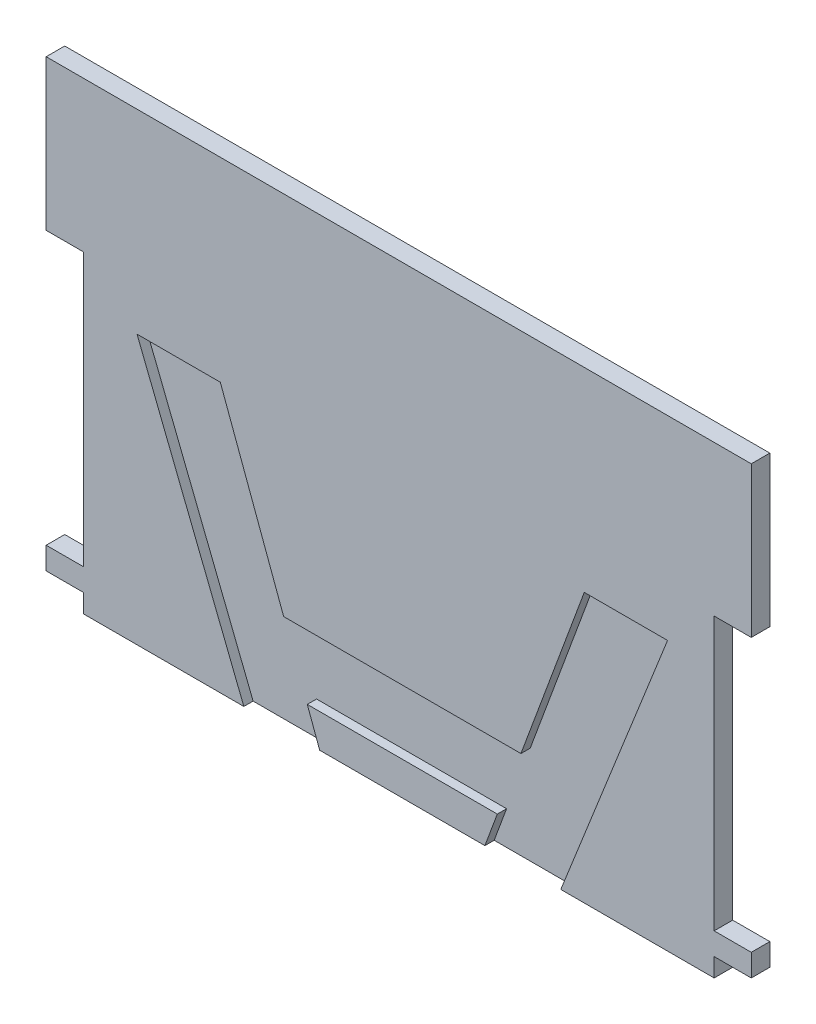
ISO-10303-21;
HEADER;
FILE_DESCRIPTION(('STEP AP214'),'2;1');
FILE_NAME('part.step','',(''),(''),'','','');
FILE_SCHEMA(('AUTOMOTIVE_DESIGN { 1 0 10303 214 1 1 1 1 }'));
ENDSEC;
DATA;
#1=APPLICATION_CONTEXT('core data for automotive mechanical design processes');
#2=APPLICATION_PROTOCOL_DEFINITION('international standard','automotive_design',2000,#1);
#3=PRODUCT_CONTEXT('',#1,'mechanical');
#4=PRODUCT('Part','Part','',(#3));
#5=PRODUCT_RELATED_PRODUCT_CATEGORY('part','',(#4));
#6=PRODUCT_DEFINITION_FORMATION('','',#4);
#7=PRODUCT_DEFINITION_CONTEXT('part definition',#1,'design');
#8=PRODUCT_DEFINITION('design','',#6,#7);
#9=PRODUCT_DEFINITION_SHAPE('','',#8);
#10=(LENGTH_UNIT() NAMED_UNIT(*) SI_UNIT(.MILLI.,.METRE.));
#11=(NAMED_UNIT(*) PLANE_ANGLE_UNIT() SI_UNIT($,.RADIAN.));
#12=(NAMED_UNIT(*) SI_UNIT($,.STERADIAN.) SOLID_ANGLE_UNIT());
#13=UNCERTAINTY_MEASURE_WITH_UNIT(LENGTH_MEASURE(1.E-05),#10,'distance_accuracy_value','');
#14=(GEOMETRIC_REPRESENTATION_CONTEXT(3) GLOBAL_UNCERTAINTY_ASSIGNED_CONTEXT((#13)) GLOBAL_UNIT_ASSIGNED_CONTEXT((#10,
#11,#12)) REPRESENTATION_CONTEXT('',''));
#15=CARTESIAN_POINT('',(0.,0.,0.));
#16=DIRECTION('',(0.,0.,1.));
#17=DIRECTION('',(1.,0.,0.));
#18=AXIS2_PLACEMENT_3D('',#15,#16,#17);
#19=CARTESIAN_POINT('',(-17.,0.5,1.));
#20=DIRECTION('',(0.,1.,0.));
#21=DIRECTION('',(0.,0.,1.));
#22=AXIS2_PLACEMENT_3D('',#19,#20,#21);
#23=PLANE('',#22);
#24=DIRECTION('',(0.,0.,1.));
#25=VECTOR('',#24,1.);
#26=CARTESIAN_POINT('',(8.73217147435897,0.5,1.));
#27=LINE('',#26,#25);
#28=CARTESIAN_POINT('',(8.73217147435897,0.5,0.5));
#29=VERTEX_POINT('',#28);
#30=CARTESIAN_POINT('',(8.73217147435897,0.5,1.));
#31=VERTEX_POINT('',#30);
#32=EDGE_CURVE('E11',#29,#31,#27,.T.);
#33=ORIENTED_EDGE('',*,*,#32,.F.);
#34=DIRECTION('',(-1.,0.,0.));
#35=VECTOR('',#34,1.);
#36=CARTESIAN_POINT('',(-17.,0.5,0.5));
#37=LINE('',#36,#35);
#38=CARTESIAN_POINT('',(4.64409857508627,0.5,0.5));
#39=VERTEX_POINT('',#38);
#40=EDGE_CURVE('E47',#29,#39,#37,.T.);
#41=ORIENTED_EDGE('',*,*,#40,.T.);
#42=DIRECTION('',(0.,0.,-1.));
#43=VECTOR('',#42,1.);
#44=CARTESIAN_POINT('',(4.64409857508627,0.5,1.));
#45=LINE('',#44,#43);
#46=CARTESIAN_POINT('',(4.64409857508627,0.5,1.));
#47=VERTEX_POINT('',#46);
#48=EDGE_CURVE('E202',#47,#39,#45,.T.);
#49=ORIENTED_EDGE('',*,*,#48,.F.);
#50=DIRECTION('',(1.,0.,0.));
#51=VECTOR('',#50,1.);
#52=CARTESIAN_POINT('',(-17.,0.5,1.));
#53=LINE('',#52,#51);
#54=CARTESIAN_POINT('',(-4.25964469981238,0.5,1.));
#55=VERTEX_POINT('',#54);
#56=EDGE_CURVE('E299',#55,#47,#53,.T.);
#57=ORIENTED_EDGE('',*,*,#56,.F.);
#58=DIRECTION('',(0.,0.,1.));
#59=VECTOR('',#58,1.);
#60=CARTESIAN_POINT('',(-4.25964469981238,0.5,1.));
#61=LINE('',#60,#59);
#62=CARTESIAN_POINT('',(-4.25964469981238,0.5,0.5));
#63=VERTEX_POINT('',#62);
#64=EDGE_CURVE('E195',#63,#55,#61,.T.);
#65=ORIENTED_EDGE('',*,*,#64,.F.);
#66=CARTESIAN_POINT('',(-8.34755608974359,0.5,0.5));
#67=VERTEX_POINT('',#66);
#68=EDGE_CURVE('E191',#63,#67,#37,.T.);
#69=ORIENTED_EDGE('',*,*,#68,.T.);
#70=DIRECTION('',(0.,0.,-1.));
#71=VECTOR('',#70,1.);
#72=CARTESIAN_POINT('',(-8.34755608974359,0.5,1.));
#73=LINE('',#72,#71);
#74=CARTESIAN_POINT('',(-8.34755608974359,0.5,1.));
#75=VERTEX_POINT('',#74);
#76=EDGE_CURVE('E200',#75,#67,#73,.T.);
#77=ORIENTED_EDGE('',*,*,#76,.F.);
#78=CARTESIAN_POINT('',(-17.,0.5,1.));
#79=VERTEX_POINT('',#78);
#80=EDGE_CURVE('E294',#79,#75,#53,.T.);
#81=ORIENTED_EDGE('',*,*,#80,.F.);
#82=DIRECTION('',(0.,0.,-1.));
#83=VECTOR('',#82,1.);
#84=CARTESIAN_POINT('',(-17.,0.5,1.));
#85=LINE('',#84,#83);
#86=CARTESIAN_POINT('',(-17.,0.5,0.));
#87=VERTEX_POINT('',#86);
#88=EDGE_CURVE('E209',#79,#87,#85,.T.);
#89=ORIENTED_EDGE('',*,*,#88,.T.);
#90=DIRECTION('',(1.,0.,0.));
#91=VECTOR('',#90,1.);
#92=CARTESIAN_POINT('',(-17.,0.5,0.));
#93=LINE('',#92,#91);
#94=CARTESIAN_POINT('',(17.,0.5,0.));
#95=VERTEX_POINT('',#94);
#96=EDGE_CURVE('E241',#87,#95,#93,.T.);
#97=ORIENTED_EDGE('',*,*,#96,.T.);
#98=DIRECTION('',(0.,0.,-1.));
#99=VECTOR('',#98,1.);
#100=CARTESIAN_POINT('',(17.,0.5,1.));
#101=LINE('',#100,#99);
#102=CARTESIAN_POINT('',(17.,0.5,1.));
#103=VERTEX_POINT('',#102);
#104=EDGE_CURVE('E208',#103,#95,#101,.T.);
#105=ORIENTED_EDGE('',*,*,#104,.F.);
#106=EDGE_CURVE('E291',#31,#103,#53,.T.);
#107=ORIENTED_EDGE('',*,*,#106,.F.);
#108=EDGE_LOOP('',(#33,#41,#49,#57,#65,#69,#77,#81,#89,#97,#105,#107));
#109=FACE_BOUND('',#108,.T.);
#110=ADVANCED_FACE('F39',(#109),#23,.F.);
#111=CARTESIAN_POINT('',(0.,0.,1.));
#112=DIRECTION('',(0.,0.,-1.));
#113=DIRECTION('',(-1.,0.,0.));
#114=AXIS2_PLACEMENT_3D('',#111,#112,#113);
#115=PLANE('',#114);
#116=ORIENTED_EDGE('',*,*,#80,.T.);
#117=DIRECTION('',(-0.369014026975487,0.929423825762679,0.));
#118=VECTOR('',#117,1.);
#119=CARTESIAN_POINT('',(-2.19350961538462,-15.,1.));
#120=LINE('',#119,#118);
#121=CARTESIAN_POINT('',(-14.1045673076923,15.,1.));
#122=VERTEX_POINT('',#121);
#123=EDGE_CURVE('E193',#75,#122,#120,.T.);
#124=ORIENTED_EDGE('',*,*,#123,.T.);
#125=DIRECTION('',(1.,0.,0.));
#126=VECTOR('',#125,1.);
#127=CARTESIAN_POINT('',(-14.1045673076923,15.,1.));
#128=LINE('',#127,#126);
#129=CARTESIAN_POINT('',(-9.61538461538462,15.,1.));
#130=VERTEX_POINT('',#129);
#131=EDGE_CURVE('E383',#122,#130,#128,.T.);
#132=ORIENTED_EDGE('',*,*,#131,.T.);
#133=DIRECTION('',(0.346837004095032,-0.937925419524593,0.));
#134=VECTOR('',#133,1.);
#135=CARTESIAN_POINT('',(-9.61538461538462,15.,1.));
#136=LINE('',#135,#134);
#137=CARTESIAN_POINT('',(-6.20192307692308,5.76923076923077,1.));
#138=VERTEX_POINT('',#137);
#139=EDGE_CURVE('E386',#130,#138,#136,.T.);
#140=ORIENTED_EDGE('',*,*,#139,.T.);
#141=DIRECTION('',(1.,0.,0.));
#142=VECTOR('',#141,1.);
#143=CARTESIAN_POINT('',(-6.20192307692308,5.76923076923077,1.));
#144=LINE('',#143,#142);
#145=CARTESIAN_POINT('',(6.58653846153846,5.76923076923077,1.));
#146=VERTEX_POINT('',#145);
#147=EDGE_CURVE('E392',#138,#146,#144,.T.);
#148=ORIENTED_EDGE('',*,*,#147,.T.);
#149=DIRECTION('',(0.346837004095032,0.937925419524593,0.));
#150=VECTOR('',#149,1.);
#151=CARTESIAN_POINT('',(6.58653846153846,5.76923076923077,1.));
#152=LINE('',#151,#150);
#153=CARTESIAN_POINT('',(10.,15.,1.));
#154=VERTEX_POINT('',#153);
#155=EDGE_CURVE('E394',#146,#154,#152,.T.);
#156=ORIENTED_EDGE('',*,*,#155,.T.);
#157=DIRECTION('',(1.,0.,0.));
#158=VECTOR('',#157,1.);
#159=CARTESIAN_POINT('',(10.,15.,1.));
#160=LINE('',#159,#158);
#161=CARTESIAN_POINT('',(14.4891826923077,15.,1.));
#162=VERTEX_POINT('',#161);
#163=EDGE_CURVE('E376',#154,#162,#160,.T.);
#164=ORIENTED_EDGE('',*,*,#163,.T.);
#165=DIRECTION('',(-0.369014026975487,-0.929423825762679,0.));
#166=VECTOR('',#165,1.);
#167=CARTESIAN_POINT('',(14.4891826923077,15.,1.));
#168=LINE('',#167,#166);
#169=EDGE_CURVE('E382',#162,#31,#168,.T.);
#170=ORIENTED_EDGE('',*,*,#169,.T.);
#171=ORIENTED_EDGE('',*,*,#106,.T.);
#172=DIRECTION('',(0.,1.,0.));
#173=VECTOR('',#172,1.);
#174=CARTESIAN_POINT('',(17.,0.5,1.));
#175=LINE('',#174,#173);
#176=CARTESIAN_POINT('',(17.,1.5,1.));
#177=VERTEX_POINT('',#176);
#178=EDGE_CURVE('E297',#103,#177,#175,.T.);
#179=ORIENTED_EDGE('',*,*,#178,.T.);
#180=DIRECTION('',(1.,0.,0.));
#181=VECTOR('',#180,1.);
#182=CARTESIAN_POINT('',(17.,1.5,1.));
#183=LINE('',#182,#181);
#184=CARTESIAN_POINT('',(19.,1.5,1.));
#185=VERTEX_POINT('',#184);
#186=EDGE_CURVE('E296',#177,#185,#183,.T.);
#187=ORIENTED_EDGE('',*,*,#186,.T.);
#188=DIRECTION('',(0.,1.,0.));
#189=VECTOR('',#188,1.);
#190=CARTESIAN_POINT('',(19.,1.5,1.));
#191=LINE('',#190,#189);
#192=CARTESIAN_POINT('',(19.,2.7,1.));
#193=VERTEX_POINT('',#192);
#194=EDGE_CURVE('E303',#185,#193,#191,.T.);
#195=ORIENTED_EDGE('',*,*,#194,.T.);
#196=DIRECTION('',(-1.,0.,0.));
#197=VECTOR('',#196,1.);
#198=CARTESIAN_POINT('',(19.,2.7,1.));
#199=LINE('',#198,#197);
#200=CARTESIAN_POINT('',(17.,2.7,1.));
#201=VERTEX_POINT('',#200);
#202=EDGE_CURVE('E301',#193,#201,#199,.T.);
#203=ORIENTED_EDGE('',*,*,#202,.T.);
#204=DIRECTION('',(0.,1.,0.));
#205=VECTOR('',#204,1.);
#206=CARTESIAN_POINT('',(17.,2.7,1.));
#207=LINE('',#206,#205);
#208=CARTESIAN_POINT('',(17.,17.3947217067352,1.));
#209=VERTEX_POINT('',#208);
#210=EDGE_CURVE('E304',#201,#209,#207,.T.);
#211=ORIENTED_EDGE('',*,*,#210,.T.);
#212=DIRECTION('',(1.,0.,0.));
#213=VECTOR('',#212,1.);
#214=CARTESIAN_POINT('',(17.,17.3947217067352,1.));
#215=LINE('',#214,#213);
#216=CARTESIAN_POINT('',(19.,17.3947217067352,1.));
#217=VERTEX_POINT('',#216);
#218=EDGE_CURVE('E310',#209,#217,#215,.T.);
#219=ORIENTED_EDGE('',*,*,#218,.T.);
#220=DIRECTION('',(0.,1.,0.));
#221=VECTOR('',#220,1.);
#222=CARTESIAN_POINT('',(19.,17.3947217067352,1.));
#223=LINE('',#222,#221);
#224=CARTESIAN_POINT('',(19.,25.5,1.));
#225=VERTEX_POINT('',#224);
#226=EDGE_CURVE('E309',#217,#225,#223,.T.);
#227=ORIENTED_EDGE('',*,*,#226,.T.);
#228=DIRECTION('',(-1.,0.,0.));
#229=VECTOR('',#228,1.);
#230=CARTESIAN_POINT('',(19.,25.5,1.));
#231=LINE('',#230,#229);
#232=CARTESIAN_POINT('',(-19.,25.5,1.));
#233=VERTEX_POINT('',#232);
#234=EDGE_CURVE('E311',#225,#233,#231,.T.);
#235=ORIENTED_EDGE('',*,*,#234,.T.);
#236=DIRECTION('',(0.,-1.,0.));
#237=VECTOR('',#236,1.);
#238=CARTESIAN_POINT('',(-19.,25.5,1.));
#239=LINE('',#238,#237);
#240=CARTESIAN_POINT('',(-19.,17.3947217067352,1.));
#241=VERTEX_POINT('',#240);
#242=EDGE_CURVE('E313',#233,#241,#239,.T.);
#243=ORIENTED_EDGE('',*,*,#242,.T.);
#244=DIRECTION('',(1.,0.,0.));
#245=VECTOR('',#244,1.);
#246=CARTESIAN_POINT('',(-19.,17.3947217067352,1.));
#247=LINE('',#246,#245);
#248=CARTESIAN_POINT('',(-17.,17.3947217067352,1.));
#249=VERTEX_POINT('',#248);
#250=EDGE_CURVE('E314',#241,#249,#247,.T.);
#251=ORIENTED_EDGE('',*,*,#250,.T.);
#252=DIRECTION('',(0.,-1.,0.));
#253=VECTOR('',#252,1.);
#254=CARTESIAN_POINT('',(-17.,17.3947217067352,1.));
#255=LINE('',#254,#253);
#256=CARTESIAN_POINT('',(-17.,2.7,1.));
#257=VERTEX_POINT('',#256);
#258=EDGE_CURVE('E174',#249,#257,#255,.T.);
#259=ORIENTED_EDGE('',*,*,#258,.T.);
#260=DIRECTION('',(-1.,0.,0.));
#261=VECTOR('',#260,1.);
#262=CARTESIAN_POINT('',(-17.,2.7,1.));
#263=LINE('',#262,#261);
#264=CARTESIAN_POINT('',(-19.,2.7,1.));
#265=VERTEX_POINT('',#264);
#266=EDGE_CURVE('E167',#257,#265,#263,.T.);
#267=ORIENTED_EDGE('',*,*,#266,.T.);
#268=DIRECTION('',(0.,-1.,0.));
#269=VECTOR('',#268,1.);
#270=CARTESIAN_POINT('',(-19.,2.7,1.));
#271=LINE('',#270,#269);
#272=CARTESIAN_POINT('',(-19.,1.5,1.));
#273=VERTEX_POINT('',#272);
#274=EDGE_CURVE('E175',#265,#273,#271,.T.);
#275=ORIENTED_EDGE('',*,*,#274,.T.);
#276=DIRECTION('',(1.,0.,0.));
#277=VECTOR('',#276,1.);
#278=CARTESIAN_POINT('',(-19.,1.5,1.));
#279=LINE('',#278,#277);
#280=CARTESIAN_POINT('',(-17.,1.5,1.));
#281=VERTEX_POINT('',#280);
#282=EDGE_CURVE('E249',#273,#281,#279,.T.);
#283=ORIENTED_EDGE('',*,*,#282,.T.);
#284=DIRECTION('',(0.,-1.,0.));
#285=VECTOR('',#284,1.);
#286=CARTESIAN_POINT('',(-17.,1.5,1.));
#287=LINE('',#286,#285);
#288=EDGE_CURVE('E122',#281,#79,#287,.T.);
#289=ORIENTED_EDGE('',*,*,#288,.T.);
#290=EDGE_LOOP('',(#116,#124,#132,#140,#148,#156,#164,#170,#171,#179,#187,#195,#203,#211,#219,
#227,#235,#243,#251,#259,#267,#275,#283,#289));
#291=FACE_BOUND('',#290,.T.);
#292=ADVANCED_FACE('F169',(#291),#115,.F.);
#293=CARTESIAN_POINT('',(-19.,1.5,1.));
#294=DIRECTION('',(0.,1.,0.));
#295=DIRECTION('',(-1.,0.,0.));
#296=AXIS2_PLACEMENT_3D('',#293,#294,#295);
#297=PLANE('',#296);
#298=DIRECTION('',(-1.,0.,0.));
#299=VECTOR('',#298,1.);
#300=CARTESIAN_POINT('',(-19.,1.5,0.));
#301=LINE('',#300,#299);
#302=CARTESIAN_POINT('',(-19.,1.5,0.));
#303=VERTEX_POINT('',#302);
#304=CARTESIAN_POINT('',(-17.,1.5,0.));
#305=VERTEX_POINT('',#304);
#306=EDGE_CURVE('E43',#303,#305,#301,.F.);
#307=ORIENTED_EDGE('',*,*,#306,.T.);
#308=DIRECTION('',(0.,0.,-1.));
#309=VECTOR('',#308,1.);
#310=CARTESIAN_POINT('',(-17.,1.5,1.));
#311=LINE('',#310,#309);
#312=EDGE_CURVE('E204',#281,#305,#311,.T.);
#313=ORIENTED_EDGE('',*,*,#312,.F.);
#314=ORIENTED_EDGE('',*,*,#282,.F.);
#315=DIRECTION('',(0.,0.,-1.));
#316=VECTOR('',#315,1.);
#317=CARTESIAN_POINT('',(-19.,1.5,1.));
#318=LINE('',#317,#316);
#319=EDGE_CURVE('E182',#273,#303,#318,.T.);
#320=ORIENTED_EDGE('',*,*,#319,.T.);
#321=EDGE_LOOP('',(#307,#313,#314,#320));
#322=FACE_BOUND('',#321,.T.);
#323=ADVANCED_FACE('F41',(#322),#297,.F.);
#324=CARTESIAN_POINT('',(-17.,1.5,1.));
#325=DIRECTION('',(1.,0.,0.));
#326=DIRECTION('',(0.,0.,-1.));
#327=AXIS2_PLACEMENT_3D('',#324,#325,#326);
#328=PLANE('',#327);
#329=DIRECTION('',(0.,1.,0.));
#330=VECTOR('',#329,1.);
#331=CARTESIAN_POINT('',(-17.,1.5,0.));
#332=LINE('',#331,#330);
#333=EDGE_CURVE('E250',#305,#87,#332,.F.);
#334=ORIENTED_EDGE('',*,*,#333,.T.);
#335=ORIENTED_EDGE('',*,*,#88,.F.);
#336=ORIENTED_EDGE('',*,*,#288,.F.);
#337=ORIENTED_EDGE('',*,*,#312,.T.);
#338=EDGE_LOOP('',(#334,#335,#336,#337));
#339=FACE_BOUND('',#338,.T.);
#340=ADVANCED_FACE('F328',(#339),#328,.F.);
#341=CARTESIAN_POINT('',(17.,0.5,1.));
#342=DIRECTION('',(-1.,0.,0.));
#343=DIRECTION('',(0.,0.,1.));
#344=AXIS2_PLACEMENT_3D('',#341,#342,#343);
#345=PLANE('',#344);
#346=DIRECTION('',(0.,1.,0.));
#347=VECTOR('',#346,1.);
#348=CARTESIAN_POINT('',(17.,0.5,0.));
#349=LINE('',#348,#347);
#350=CARTESIAN_POINT('',(17.,1.5,0.));
#351=VERTEX_POINT('',#350);
#352=EDGE_CURVE('E247',#95,#351,#349,.T.);
#353=ORIENTED_EDGE('',*,*,#352,.T.);
#354=DIRECTION('',(0.,0.,-1.));
#355=VECTOR('',#354,1.);
#356=CARTESIAN_POINT('',(17.,1.5,1.));
#357=LINE('',#356,#355);
#358=EDGE_CURVE('E211',#177,#351,#357,.T.);
#359=ORIENTED_EDGE('',*,*,#358,.F.);
#360=ORIENTED_EDGE('',*,*,#178,.F.);
#361=ORIENTED_EDGE('',*,*,#104,.T.);
#362=EDGE_LOOP('',(#353,#359,#360,#361));
#363=FACE_BOUND('',#362,.T.);
#364=ADVANCED_FACE('F520',(#363),#345,.F.);
#365=CARTESIAN_POINT('',(17.,1.5,1.));
#366=DIRECTION('',(0.,1.,0.));
#367=DIRECTION('',(-1.,0.,0.));
#368=AXIS2_PLACEMENT_3D('',#365,#366,#367);
#369=PLANE('',#368);
#370=DIRECTION('',(-1.,0.,0.));
#371=VECTOR('',#370,1.);
#372=CARTESIAN_POINT('',(17.,1.5,0.));
#373=LINE('',#372,#371);
#374=CARTESIAN_POINT('',(19.,1.5,0.));
#375=VERTEX_POINT('',#374);
#376=EDGE_CURVE('E267',#351,#375,#373,.F.);
#377=ORIENTED_EDGE('',*,*,#376,.T.);
#378=DIRECTION('',(0.,0.,-1.));
#379=VECTOR('',#378,1.);
#380=CARTESIAN_POINT('',(19.,1.5,1.));
#381=LINE('',#380,#379);
#382=EDGE_CURVE('E218',#185,#375,#381,.T.);
#383=ORIENTED_EDGE('',*,*,#382,.F.);
#384=ORIENTED_EDGE('',*,*,#186,.F.);
#385=ORIENTED_EDGE('',*,*,#358,.T.);
#386=EDGE_LOOP('',(#377,#383,#384,#385));
#387=FACE_BOUND('',#386,.T.);
#388=ADVANCED_FACE('F525',(#387),#369,.F.);
#389=CARTESIAN_POINT('',(19.,1.5,1.));
#390=DIRECTION('',(-1.,0.,0.));
#391=DIRECTION('',(0.,0.,1.));
#392=AXIS2_PLACEMENT_3D('',#389,#390,#391);
#393=PLANE('',#392);
#394=DIRECTION('',(0.,1.,0.));
#395=VECTOR('',#394,1.);
#396=CARTESIAN_POINT('',(19.,1.5,0.));
#397=LINE('',#396,#395);
#398=CARTESIAN_POINT('',(19.,2.7,0.));
#399=VERTEX_POINT('',#398);
#400=EDGE_CURVE('E270',#375,#399,#397,.T.);
#401=ORIENTED_EDGE('',*,*,#400,.T.);
#402=DIRECTION('',(0.,0.,-1.));
#403=VECTOR('',#402,1.);
#404=CARTESIAN_POINT('',(19.,2.7,1.));
#405=LINE('',#404,#403);
#406=EDGE_CURVE('E219',#193,#399,#405,.T.);
#407=ORIENTED_EDGE('',*,*,#406,.F.);
#408=ORIENTED_EDGE('',*,*,#194,.F.);
#409=ORIENTED_EDGE('',*,*,#382,.T.);
#410=EDGE_LOOP('',(#401,#407,#408,#409));
#411=FACE_BOUND('',#410,.T.);
#412=ADVANCED_FACE('F552',(#411),#393,.F.);
#413=CARTESIAN_POINT('',(19.,2.7,1.));
#414=DIRECTION('',(0.,-1.,0.));
#415=DIRECTION('',(0.,0.,-1.));
#416=AXIS2_PLACEMENT_3D('',#413,#414,#415);
#417=PLANE('',#416);
#418=DIRECTION('',(1.,0.,0.));
#419=VECTOR('',#418,1.);
#420=CARTESIAN_POINT('',(19.,2.7,0.));
#421=LINE('',#420,#419);
#422=CARTESIAN_POINT('',(17.,2.7,0.));
#423=VERTEX_POINT('',#422);
#424=EDGE_CURVE('E262',#399,#423,#421,.F.);
#425=ORIENTED_EDGE('',*,*,#424,.T.);
#426=DIRECTION('',(0.,0.,-1.));
#427=VECTOR('',#426,1.);
#428=CARTESIAN_POINT('',(17.,2.7,1.));
#429=LINE('',#428,#427);
#430=EDGE_CURVE('E225',#201,#423,#429,.T.);
#431=ORIENTED_EDGE('',*,*,#430,.F.);
#432=ORIENTED_EDGE('',*,*,#202,.F.);
#433=ORIENTED_EDGE('',*,*,#406,.T.);
#434=EDGE_LOOP('',(#425,#431,#432,#433));
#435=FACE_BOUND('',#434,.T.);
#436=ADVANCED_FACE('F562',(#435),#417,.F.);
#437=CARTESIAN_POINT('',(17.,2.7,1.));
#438=DIRECTION('',(-1.,0.,0.));
#439=DIRECTION('',(0.,0.,1.));
#440=AXIS2_PLACEMENT_3D('',#437,#438,#439);
#441=PLANE('',#440);
#442=DIRECTION('',(0.,1.,0.));
#443=VECTOR('',#442,1.);
#444=CARTESIAN_POINT('',(17.,2.7,0.));
#445=LINE('',#444,#443);
#446=CARTESIAN_POINT('',(17.,17.3947217067352,0.));
#447=VERTEX_POINT('',#446);
#448=EDGE_CURVE('E261',#423,#447,#445,.T.);
#449=ORIENTED_EDGE('',*,*,#448,.T.);
#450=DIRECTION('',(0.,0.,-1.));
#451=VECTOR('',#450,1.);
#452=CARTESIAN_POINT('',(17.,17.3947217067352,1.));
#453=LINE('',#452,#451);
#454=EDGE_CURVE('E224',#209,#447,#453,.T.);
#455=ORIENTED_EDGE('',*,*,#454,.F.);
#456=ORIENTED_EDGE('',*,*,#210,.F.);
#457=ORIENTED_EDGE('',*,*,#430,.T.);
#458=EDGE_LOOP('',(#449,#455,#456,#457));
#459=FACE_BOUND('',#458,.T.);
#460=ADVANCED_FACE('F573',(#459),#441,.F.);
#461=CARTESIAN_POINT('',(17.,17.3947217067352,1.));
#462=DIRECTION('',(0.,1.,0.));
#463=DIRECTION('',(0.,0.,1.));
#464=AXIS2_PLACEMENT_3D('',#461,#462,#463);
#465=PLANE('',#464);
#466=DIRECTION('',(1.,0.,0.));
#467=VECTOR('',#466,1.);
#468=CARTESIAN_POINT('',(17.,17.3947217067352,0.));
#469=LINE('',#468,#467);
#470=CARTESIAN_POINT('',(19.,17.3947217067352,0.));
#471=VERTEX_POINT('',#470);
#472=EDGE_CURVE('E263',#447,#471,#469,.T.);
#473=ORIENTED_EDGE('',*,*,#472,.T.);
#474=DIRECTION('',(0.,0.,-1.));
#475=VECTOR('',#474,1.);
#476=CARTESIAN_POINT('',(19.,17.3947217067352,1.));
#477=LINE('',#476,#475);
#478=EDGE_CURVE('E228',#217,#471,#477,.T.);
#479=ORIENTED_EDGE('',*,*,#478,.F.);
#480=ORIENTED_EDGE('',*,*,#218,.F.);
#481=ORIENTED_EDGE('',*,*,#454,.T.);
#482=EDGE_LOOP('',(#473,#479,#480,#481));
#483=FACE_BOUND('',#482,.T.);
#484=ADVANCED_FACE('F581',(#483),#465,.F.);
#485=CARTESIAN_POINT('',(19.,17.3947217067352,1.));
#486=DIRECTION('',(-1.,0.,0.));
#487=DIRECTION('',(0.,0.,1.));
#488=AXIS2_PLACEMENT_3D('',#485,#486,#487);
#489=PLANE('',#488);
#490=DIRECTION('',(0.,1.,0.));
#491=VECTOR('',#490,1.);
#492=CARTESIAN_POINT('',(19.,17.3947217067352,0.));
#493=LINE('',#492,#491);
#494=CARTESIAN_POINT('',(19.,25.5,0.));
#495=VERTEX_POINT('',#494);
#496=EDGE_CURVE('E260',#471,#495,#493,.T.);
#497=ORIENTED_EDGE('',*,*,#496,.T.);
#498=DIRECTION('',(0.,0.,-1.));
#499=VECTOR('',#498,1.);
#500=CARTESIAN_POINT('',(19.,25.5,1.));
#501=LINE('',#500,#499);
#502=EDGE_CURVE('E231',#225,#495,#501,.T.);
#503=ORIENTED_EDGE('',*,*,#502,.F.);
#504=ORIENTED_EDGE('',*,*,#226,.F.);
#505=ORIENTED_EDGE('',*,*,#478,.T.);
#506=EDGE_LOOP('',(#497,#503,#504,#505));
#507=FACE_BOUND('',#506,.T.);
#508=ADVANCED_FACE('F591',(#507),#489,.F.);
#509=CARTESIAN_POINT('',(19.,25.5,1.));
#510=DIRECTION('',(0.,-1.,0.));
#511=DIRECTION('',(0.,0.,-1.));
#512=AXIS2_PLACEMENT_3D('',#509,#510,#511);
#513=PLANE('',#512);
#514=DIRECTION('',(1.,0.,0.));
#515=VECTOR('',#514,1.);
#516=CARTESIAN_POINT('',(19.,25.5,0.));
#517=LINE('',#516,#515);
#518=CARTESIAN_POINT('',(-19.,25.5,0.));
#519=VERTEX_POINT('',#518);
#520=EDGE_CURVE('E257',#495,#519,#517,.F.);
#521=ORIENTED_EDGE('',*,*,#520,.T.);
#522=DIRECTION('',(0.,0.,-1.));
#523=VECTOR('',#522,1.);
#524=CARTESIAN_POINT('',(-19.,25.5,1.));
#525=LINE('',#524,#523);
#526=EDGE_CURVE('E233',#233,#519,#525,.T.);
#527=ORIENTED_EDGE('',*,*,#526,.F.);
#528=ORIENTED_EDGE('',*,*,#234,.F.);
#529=ORIENTED_EDGE('',*,*,#502,.T.);
#530=EDGE_LOOP('',(#521,#527,#528,#529));
#531=FACE_BOUND('',#530,.T.);
#532=ADVANCED_FACE('F602',(#531),#513,.F.);
#533=CARTESIAN_POINT('',(-19.,25.5,1.));
#534=DIRECTION('',(1.,0.,0.));
#535=DIRECTION('',(0.,0.,-1.));
#536=AXIS2_PLACEMENT_3D('',#533,#534,#535);
#537=PLANE('',#536);
#538=DIRECTION('',(0.,1.,0.));
#539=VECTOR('',#538,1.);
#540=CARTESIAN_POINT('',(-19.,25.5,0.));
#541=LINE('',#540,#539);
#542=CARTESIAN_POINT('',(-19.,17.3947217067352,0.));
#543=VERTEX_POINT('',#542);
#544=EDGE_CURVE('E253',#519,#543,#541,.F.);
#545=ORIENTED_EDGE('',*,*,#544,.T.);
#546=DIRECTION('',(0.,0.,-1.));
#547=VECTOR('',#546,1.);
#548=CARTESIAN_POINT('',(-19.,17.3947217067352,1.));
#549=LINE('',#548,#547);
#550=EDGE_CURVE('E240',#241,#543,#549,.T.);
#551=ORIENTED_EDGE('',*,*,#550,.F.);
#552=ORIENTED_EDGE('',*,*,#242,.F.);
#553=ORIENTED_EDGE('',*,*,#526,.T.);
#554=EDGE_LOOP('',(#545,#551,#552,#553));
#555=FACE_BOUND('',#554,.T.);
#556=ADVANCED_FACE('F612',(#555),#537,.F.);
#557=CARTESIAN_POINT('',(-19.,17.3947217067352,1.));
#558=DIRECTION('',(0.,1.,0.));
#559=DIRECTION('',(0.,0.,1.));
#560=AXIS2_PLACEMENT_3D('',#557,#558,#559);
#561=PLANE('',#560);
#562=DIRECTION('',(1.,0.,0.));
#563=VECTOR('',#562,1.);
#564=CARTESIAN_POINT('',(-19.,17.3947217067352,0.));
#565=LINE('',#564,#563);
#566=CARTESIAN_POINT('',(-17.,17.3947217067352,0.));
#567=VERTEX_POINT('',#566);
#568=EDGE_CURVE('E255',#543,#567,#565,.T.);
#569=ORIENTED_EDGE('',*,*,#568,.T.);
#570=DIRECTION('',(0.,0.,-1.));
#571=VECTOR('',#570,1.);
#572=CARTESIAN_POINT('',(-17.,17.3947217067352,1.));
#573=LINE('',#572,#571);
#574=EDGE_CURVE('E238',#249,#567,#573,.T.);
#575=ORIENTED_EDGE('',*,*,#574,.F.);
#576=ORIENTED_EDGE('',*,*,#250,.F.);
#577=ORIENTED_EDGE('',*,*,#550,.T.);
#578=EDGE_LOOP('',(#569,#575,#576,#577));
#579=FACE_BOUND('',#578,.T.);
#580=ADVANCED_FACE('F321',(#579),#561,.F.);
#581=CARTESIAN_POINT('',(-17.,17.3947217067352,1.));
#582=DIRECTION('',(1.,0.,0.));
#583=DIRECTION('',(0.,0.,-1.));
#584=AXIS2_PLACEMENT_3D('',#581,#582,#583);
#585=PLANE('',#584);
#586=DIRECTION('',(0.,1.,0.));
#587=VECTOR('',#586,1.);
#588=CARTESIAN_POINT('',(-17.,17.3947217067352,0.));
#589=LINE('',#588,#587);
#590=CARTESIAN_POINT('',(-17.,2.7,0.));
#591=VERTEX_POINT('',#590);
#592=EDGE_CURVE('E252',#567,#591,#589,.F.);
#593=ORIENTED_EDGE('',*,*,#592,.T.);
#594=DIRECTION('',(0.,0.,-1.));
#595=VECTOR('',#594,1.);
#596=CARTESIAN_POINT('',(-17.,2.7,1.));
#597=LINE('',#596,#595);
#598=EDGE_CURVE('E183',#257,#591,#597,.T.);
#599=ORIENTED_EDGE('',*,*,#598,.F.);
#600=ORIENTED_EDGE('',*,*,#258,.F.);
#601=ORIENTED_EDGE('',*,*,#574,.T.);
#602=EDGE_LOOP('',(#593,#599,#600,#601));
#603=FACE_BOUND('',#602,.T.);
#604=ADVANCED_FACE('F324',(#603),#585,.F.);
#605=CARTESIAN_POINT('',(-17.,2.7,1.));
#606=DIRECTION('',(0.,-1.,0.));
#607=DIRECTION('',(0.,0.,-1.));
#608=AXIS2_PLACEMENT_3D('',#605,#606,#607);
#609=PLANE('',#608);
#610=DIRECTION('',(1.,0.,0.));
#611=VECTOR('',#610,1.);
#612=CARTESIAN_POINT('',(-17.,2.7,0.));
#613=LINE('',#612,#611);
#614=CARTESIAN_POINT('',(-19.,2.7,0.));
#615=VERTEX_POINT('',#614);
#616=EDGE_CURVE('E185',#591,#615,#613,.F.);
#617=ORIENTED_EDGE('',*,*,#616,.T.);
#618=DIRECTION('',(0.,0.,-1.));
#619=VECTOR('',#618,1.);
#620=CARTESIAN_POINT('',(-19.,2.7,1.));
#621=LINE('',#620,#619);
#622=EDGE_CURVE('E177',#265,#615,#621,.T.);
#623=ORIENTED_EDGE('',*,*,#622,.F.);
#624=ORIENTED_EDGE('',*,*,#266,.F.);
#625=ORIENTED_EDGE('',*,*,#598,.T.);
#626=EDGE_LOOP('',(#617,#623,#624,#625));
#627=FACE_BOUND('',#626,.T.);
#628=ADVANCED_FACE('F179',(#627),#609,.F.);
#629=CARTESIAN_POINT('',(-19.,2.7,1.));
#630=DIRECTION('',(1.,0.,0.));
#631=DIRECTION('',(0.,0.,-1.));
#632=AXIS2_PLACEMENT_3D('',#629,#630,#631);
#633=PLANE('',#632);
#634=DIRECTION('',(0.,1.,0.));
#635=VECTOR('',#634,1.);
#636=CARTESIAN_POINT('',(-19.,2.7,0.));
#637=LINE('',#636,#635);
#638=EDGE_CURVE('E111',#615,#303,#637,.F.);
#639=ORIENTED_EDGE('',*,*,#638,.T.);
#640=ORIENTED_EDGE('',*,*,#319,.F.);
#641=ORIENTED_EDGE('',*,*,#274,.F.);
#642=ORIENTED_EDGE('',*,*,#622,.T.);
#643=EDGE_LOOP('',(#639,#640,#641,#642));
#644=FACE_BOUND('',#643,.T.);
#645=ADVANCED_FACE('F186',(#644),#633,.F.);
#646=ORIENTED_EDGE('',*,*,#56,.T.);
#647=DIRECTION('',(0.346805908159069,0.93793691795662,0.));
#648=VECTOR('',#647,1.);
#649=CARTESIAN_POINT('',(2.24158653846154,-5.99759615384616,1.));
#650=LINE('',#649,#648);
#651=CARTESIAN_POINT('',(5.3125,2.30769230769231,1.));
#652=VERTEX_POINT('',#651);
#653=EDGE_CURVE('E207',#47,#652,#650,.T.);
#654=ORIENTED_EDGE('',*,*,#653,.T.);
#655=DIRECTION('',(-1.,0.,0.));
#656=VECTOR('',#655,1.);
#657=CARTESIAN_POINT('',(5.3125,2.30769230769231,1.));
#658=LINE('',#657,#656);
#659=CARTESIAN_POINT('',(-4.92788461538462,2.30769230769231,1.));
#660=VERTEX_POINT('',#659);
#661=EDGE_CURVE('E474',#652,#660,#658,.T.);
#662=ORIENTED_EDGE('',*,*,#661,.T.);
#663=DIRECTION('',(0.346732183468385,-0.937964174660869,0.));
#664=VECTOR('',#663,1.);
#665=CARTESIAN_POINT('',(-4.92788461538462,2.30769230769231,1.));
#666=LINE('',#665,#664);
#667=EDGE_CURVE('E59',#660,#55,#666,.T.);
#668=ORIENTED_EDGE('',*,*,#667,.T.);
#669=EDGE_LOOP('',(#646,#654,#662,#668));
#670=FACE_BOUND('',#669,.T.);
#671=ADVANCED_FACE('F465',(#670),#115,.F.);
#672=CARTESIAN_POINT('',(0.,0.,0.));
#673=DIRECTION('',(0.,0.,-1.));
#674=DIRECTION('',(-1.,0.,0.));
#675=AXIS2_PLACEMENT_3D('',#672,#673,#674);
#676=PLANE('',#675);
#677=ORIENTED_EDGE('',*,*,#306,.F.);
#678=ORIENTED_EDGE('',*,*,#638,.F.);
#679=ORIENTED_EDGE('',*,*,#616,.F.);
#680=ORIENTED_EDGE('',*,*,#592,.F.);
#681=ORIENTED_EDGE('',*,*,#568,.F.);
#682=ORIENTED_EDGE('',*,*,#544,.F.);
#683=ORIENTED_EDGE('',*,*,#520,.F.);
#684=ORIENTED_EDGE('',*,*,#496,.F.);
#685=ORIENTED_EDGE('',*,*,#472,.F.);
#686=ORIENTED_EDGE('',*,*,#448,.F.);
#687=ORIENTED_EDGE('',*,*,#424,.F.);
#688=ORIENTED_EDGE('',*,*,#400,.F.);
#689=ORIENTED_EDGE('',*,*,#376,.F.);
#690=ORIENTED_EDGE('',*,*,#352,.F.);
#691=ORIENTED_EDGE('',*,*,#96,.F.);
#692=ORIENTED_EDGE('',*,*,#333,.F.);
#693=EDGE_LOOP('',(#677,#678,#679,#680,#681,#682,#683,#684,#685,#686,#687,#688,#689,#690,#691,#692));
#694=FACE_BOUND('',#693,.T.);
#695=ADVANCED_FACE('F330',(#694),#676,.T.);
#696=CARTESIAN_POINT('',(14.4891826923077,15.,0.5));
#697=DIRECTION('',(-0.929423825762679,0.369014026975487,0.));
#698=DIRECTION('',(-0.369014026975487,-0.929423825762679,0.));
#699=AXIS2_PLACEMENT_3D('',#696,#697,#698);
#700=PLANE('',#699);
#701=ORIENTED_EDGE('',*,*,#32,.T.);
#702=ORIENTED_EDGE('',*,*,#169,.F.);
#703=DIRECTION('',(0.,0.,1.));
#704=VECTOR('',#703,1.);
#705=CARTESIAN_POINT('',(14.4891826923077,15.,0.5));
#706=LINE('',#705,#704);
#707=CARTESIAN_POINT('',(14.4891826923077,15.,0.5));
#708=VERTEX_POINT('',#707);
#709=EDGE_CURVE('E273',#708,#162,#706,.T.);
#710=ORIENTED_EDGE('',*,*,#709,.F.);
#711=DIRECTION('',(-0.369014026975487,-0.929423825762679,0.));
#712=VECTOR('',#711,1.);
#713=CARTESIAN_POINT('',(14.4891826923077,15.,0.5));
#714=LINE('',#713,#712);
#715=EDGE_CURVE('E361',#708,#29,#714,.T.);
#716=ORIENTED_EDGE('',*,*,#715,.T.);
#717=EDGE_LOOP('',(#701,#702,#710,#716));
#718=FACE_BOUND('',#717,.T.);
#719=ADVANCED_FACE('F452',(#718),#700,.T.);
#720=CARTESIAN_POINT('',(-2.19350961538462,-15.,0.5));
#721=DIRECTION('',(0.929423825762679,0.369014026975487,0.));
#722=DIRECTION('',(-0.369014026975487,0.929423825762679,0.));
#723=AXIS2_PLACEMENT_3D('',#720,#721,#722);
#724=PLANE('',#723);
#725=ORIENTED_EDGE('',*,*,#76,.T.);
#726=DIRECTION('',(-0.369014026975487,0.929423825762679,0.));
#727=VECTOR('',#726,1.);
#728=CARTESIAN_POINT('',(-2.19350961538462,-15.,0.5));
#729=LINE('',#728,#727);
#730=CARTESIAN_POINT('',(-14.1045673076923,15.,0.5));
#731=VERTEX_POINT('',#730);
#732=EDGE_CURVE('E346',#67,#731,#729,.T.);
#733=ORIENTED_EDGE('',*,*,#732,.T.);
#734=DIRECTION('',(0.,0.,1.));
#735=VECTOR('',#734,1.);
#736=CARTESIAN_POINT('',(-14.1045673076923,15.,0.5));
#737=LINE('',#736,#735);
#738=EDGE_CURVE('E277',#731,#122,#737,.T.);
#739=ORIENTED_EDGE('',*,*,#738,.T.);
#740=ORIENTED_EDGE('',*,*,#123,.F.);
#741=EDGE_LOOP('',(#725,#733,#739,#740));
#742=FACE_BOUND('',#741,.T.);
#743=ADVANCED_FACE('F348',(#742),#724,.T.);
#744=CARTESIAN_POINT('',(0.,0.,0.5));
#745=DIRECTION('',(0.,0.,-1.));
#746=DIRECTION('',(-1.,0.,0.));
#747=AXIS2_PLACEMENT_3D('',#744,#745,#746);
#748=PLANE('',#747);
#749=ORIENTED_EDGE('',*,*,#715,.F.);
#750=DIRECTION('',(1.,0.,0.));
#751=VECTOR('',#750,1.);
#752=CARTESIAN_POINT('',(10.,15.,0.5));
#753=LINE('',#752,#751);
#754=CARTESIAN_POINT('',(10.,15.,0.5));
#755=VERTEX_POINT('',#754);
#756=EDGE_CURVE('E366',#755,#708,#753,.T.);
#757=ORIENTED_EDGE('',*,*,#756,.F.);
#758=DIRECTION('',(0.346837004095032,0.937925419524593,0.));
#759=VECTOR('',#758,1.);
#760=CARTESIAN_POINT('',(6.58653846153846,5.76923076923077,0.5));
#761=LINE('',#760,#759);
#762=CARTESIAN_POINT('',(6.58653846153846,5.76923076923077,0.5));
#763=VERTEX_POINT('',#762);
#764=EDGE_CURVE('E373',#763,#755,#761,.T.);
#765=ORIENTED_EDGE('',*,*,#764,.F.);
#766=DIRECTION('',(1.,0.,0.));
#767=VECTOR('',#766,1.);
#768=CARTESIAN_POINT('',(-6.20192307692308,5.76923076923077,0.5));
#769=LINE('',#768,#767);
#770=CARTESIAN_POINT('',(-6.20192307692308,5.76923076923077,0.5));
#771=VERTEX_POINT('',#770);
#772=EDGE_CURVE('E375',#771,#763,#769,.T.);
#773=ORIENTED_EDGE('',*,*,#772,.F.);
#774=DIRECTION('',(0.346837004095032,-0.937925419524593,0.));
#775=VECTOR('',#774,1.);
#776=CARTESIAN_POINT('',(-9.61538461538462,15.,0.5));
#777=LINE('',#776,#775);
#778=CARTESIAN_POINT('',(-9.61538461538462,15.,0.5));
#779=VERTEX_POINT('',#778);
#780=EDGE_CURVE('E363',#779,#771,#777,.T.);
#781=ORIENTED_EDGE('',*,*,#780,.F.);
#782=DIRECTION('',(1.,0.,0.));
#783=VECTOR('',#782,1.);
#784=CARTESIAN_POINT('',(-14.1045673076923,15.,0.5));
#785=LINE('',#784,#783);
#786=EDGE_CURVE('E359',#731,#779,#785,.T.);
#787=ORIENTED_EDGE('',*,*,#786,.F.);
#788=ORIENTED_EDGE('',*,*,#732,.F.);
#789=ORIENTED_EDGE('',*,*,#68,.F.);
#790=DIRECTION('',(0.346732183468385,-0.937964174660869,0.));
#791=VECTOR('',#790,1.);
#792=CARTESIAN_POINT('',(-4.92788461538462,2.30769230769231,0.5));
#793=LINE('',#792,#791);
#794=CARTESIAN_POINT('',(-4.92788461538462,2.30769230769231,0.5));
#795=VERTEX_POINT('',#794);
#796=EDGE_CURVE('E475',#795,#63,#793,.T.);
#797=ORIENTED_EDGE('',*,*,#796,.F.);
#798=DIRECTION('',(-1.,0.,0.));
#799=VECTOR('',#798,1.);
#800=CARTESIAN_POINT('',(5.3125,2.30769230769231,0.5));
#801=LINE('',#800,#799);
#802=CARTESIAN_POINT('',(5.3125,2.30769230769231,0.5));
#803=VERTEX_POINT('',#802);
#804=EDGE_CURVE('E784',#803,#795,#801,.T.);
#805=ORIENTED_EDGE('',*,*,#804,.F.);
#806=DIRECTION('',(0.346805908159069,0.93793691795662,0.));
#807=VECTOR('',#806,1.);
#808=CARTESIAN_POINT('',(2.24158653846154,-5.99759615384616,0.5));
#809=LINE('',#808,#807);
#810=EDGE_CURVE('E451',#39,#803,#809,.T.);
#811=ORIENTED_EDGE('',*,*,#810,.F.);
#812=ORIENTED_EDGE('',*,*,#40,.F.);
#813=EDGE_LOOP('',(#749,#757,#765,#773,#781,#787,#788,#789,#797,#805,#811,#812));
#814=FACE_BOUND('',#813,.T.);
#815=ADVANCED_FACE('F354',(#814),#748,.F.);
#816=CARTESIAN_POINT('',(2.24158653846154,-5.99759615384616,0.5));
#817=DIRECTION('',(0.93793691795662,-0.346805908159069,0.));
#818=DIRECTION('',(0.346805908159069,0.93793691795662,0.));
#819=AXIS2_PLACEMENT_3D('',#816,#817,#818);
#820=PLANE('',#819);
#821=ORIENTED_EDGE('',*,*,#48,.T.);
#822=ORIENTED_EDGE('',*,*,#810,.T.);
#823=DIRECTION('',(0.,0.,1.));
#824=VECTOR('',#823,1.);
#825=CARTESIAN_POINT('',(5.3125,2.30769230769231,0.5));
#826=LINE('',#825,#824);
#827=EDGE_CURVE('E469',#803,#652,#826,.T.);
#828=ORIENTED_EDGE('',*,*,#827,.T.);
#829=ORIENTED_EDGE('',*,*,#653,.F.);
#830=EDGE_LOOP('',(#821,#822,#828,#829));
#831=FACE_BOUND('',#830,.T.);
#832=ADVANCED_FACE('F463',(#831),#820,.T.);
#833=CARTESIAN_POINT('',(-4.92788461538462,2.30769230769231,0.5));
#834=DIRECTION('',(-0.937964174660869,-0.346732183468385,0.));
#835=DIRECTION('',(0.346732183468385,-0.937964174660869,0.));
#836=AXIS2_PLACEMENT_3D('',#833,#834,#835);
#837=PLANE('',#836);
#838=ORIENTED_EDGE('',*,*,#64,.T.);
#839=ORIENTED_EDGE('',*,*,#667,.F.);
#840=DIRECTION('',(0.,0.,1.));
#841=VECTOR('',#840,1.);
#842=CARTESIAN_POINT('',(-4.92788461538462,2.30769230769231,0.5));
#843=LINE('',#842,#841);
#844=EDGE_CURVE('E385',#795,#660,#843,.T.);
#845=ORIENTED_EDGE('',*,*,#844,.F.);
#846=ORIENTED_EDGE('',*,*,#796,.T.);
#847=EDGE_LOOP('',(#838,#839,#845,#846));
#848=FACE_BOUND('',#847,.T.);
#849=ADVANCED_FACE('F719',(#848),#837,.T.);
#850=CARTESIAN_POINT('',(10.,15.,0.5));
#851=DIRECTION('',(0.,-1.,0.));
#852=DIRECTION('',(0.,0.,-1.));
#853=AXIS2_PLACEMENT_3D('',#850,#851,#852);
#854=PLANE('',#853);
#855=ORIENTED_EDGE('',*,*,#163,.F.);
#856=DIRECTION('',(0.,0.,1.));
#857=VECTOR('',#856,1.);
#858=CARTESIAN_POINT('',(10.,15.,0.5));
#859=LINE('',#858,#857);
#860=EDGE_CURVE('E380',#755,#154,#859,.T.);
#861=ORIENTED_EDGE('',*,*,#860,.F.);
#862=ORIENTED_EDGE('',*,*,#756,.T.);
#863=ORIENTED_EDGE('',*,*,#709,.T.);
#864=EDGE_LOOP('',(#855,#861,#862,#863));
#865=FACE_BOUND('',#864,.T.);
#866=ADVANCED_FACE('F476',(#865),#854,.T.);
#867=CARTESIAN_POINT('',(-14.1045673076923,15.,0.5));
#868=DIRECTION('',(0.,-1.,0.));
#869=DIRECTION('',(0.,0.,-1.));
#870=AXIS2_PLACEMENT_3D('',#867,#868,#869);
#871=PLANE('',#870);
#872=ORIENTED_EDGE('',*,*,#131,.F.);
#873=ORIENTED_EDGE('',*,*,#738,.F.);
#874=ORIENTED_EDGE('',*,*,#786,.T.);
#875=DIRECTION('',(0.,0.,1.));
#876=VECTOR('',#875,1.);
#877=CARTESIAN_POINT('',(-9.61538461538462,15.,0.5));
#878=LINE('',#877,#876);
#879=EDGE_CURVE('E289',#779,#130,#878,.T.);
#880=ORIENTED_EDGE('',*,*,#879,.T.);
#881=EDGE_LOOP('',(#872,#873,#874,#880));
#882=FACE_BOUND('',#881,.T.);
#883=ADVANCED_FACE('F411',(#882),#871,.T.);
#884=CARTESIAN_POINT('',(-9.61538461538462,15.,0.5));
#885=DIRECTION('',(-0.937925419524593,-0.346837004095032,0.));
#886=DIRECTION('',(0.346837004095032,-0.937925419524593,0.));
#887=AXIS2_PLACEMENT_3D('',#884,#885,#886);
#888=PLANE('',#887);
#889=ORIENTED_EDGE('',*,*,#139,.F.);
#890=ORIENTED_EDGE('',*,*,#879,.F.);
#891=ORIENTED_EDGE('',*,*,#780,.T.);
#892=DIRECTION('',(0.,0.,1.));
#893=VECTOR('',#892,1.);
#894=CARTESIAN_POINT('',(-6.20192307692308,5.76923076923077,0.5));
#895=LINE('',#894,#893);
#896=EDGE_CURVE('E403',#771,#138,#895,.T.);
#897=ORIENTED_EDGE('',*,*,#896,.T.);
#898=EDGE_LOOP('',(#889,#890,#891,#897));
#899=FACE_BOUND('',#898,.T.);
#900=ADVANCED_FACE('F420',(#899),#888,.T.);
#901=CARTESIAN_POINT('',(-6.20192307692308,5.76923076923077,0.5));
#902=DIRECTION('',(0.,-1.,0.));
#903=DIRECTION('',(0.,0.,-1.));
#904=AXIS2_PLACEMENT_3D('',#901,#902,#903);
#905=PLANE('',#904);
#906=ORIENTED_EDGE('',*,*,#147,.F.);
#907=ORIENTED_EDGE('',*,*,#896,.F.);
#908=ORIENTED_EDGE('',*,*,#772,.T.);
#909=DIRECTION('',(0.,0.,1.));
#910=VECTOR('',#909,1.);
#911=CARTESIAN_POINT('',(6.58653846153846,5.76923076923077,0.5));
#912=LINE('',#911,#910);
#913=EDGE_CURVE('E397',#763,#146,#912,.T.);
#914=ORIENTED_EDGE('',*,*,#913,.T.);
#915=EDGE_LOOP('',(#906,#907,#908,#914));
#916=FACE_BOUND('',#915,.T.);
#917=ADVANCED_FACE('F493',(#916),#905,.T.);
#918=CARTESIAN_POINT('',(6.58653846153846,5.76923076923077,0.5));
#919=DIRECTION('',(0.937925419524593,-0.346837004095032,0.));
#920=DIRECTION('',(0.346837004095032,0.937925419524593,0.));
#921=AXIS2_PLACEMENT_3D('',#918,#919,#920);
#922=PLANE('',#921);
#923=ORIENTED_EDGE('',*,*,#155,.F.);
#924=ORIENTED_EDGE('',*,*,#913,.F.);
#925=ORIENTED_EDGE('',*,*,#764,.T.);
#926=ORIENTED_EDGE('',*,*,#860,.T.);
#927=EDGE_LOOP('',(#923,#924,#925,#926));
#928=FACE_BOUND('',#927,.T.);
#929=ADVANCED_FACE('F494',(#928),#922,.T.);
#930=CARTESIAN_POINT('',(5.3125,2.30769230769231,0.5));
#931=DIRECTION('',(0.,1.,0.));
#932=DIRECTION('',(0.,0.,1.));
#933=AXIS2_PLACEMENT_3D('',#930,#931,#932);
#934=PLANE('',#933);
#935=ORIENTED_EDGE('',*,*,#661,.F.);
#936=ORIENTED_EDGE('',*,*,#827,.F.);
#937=ORIENTED_EDGE('',*,*,#804,.T.);
#938=ORIENTED_EDGE('',*,*,#844,.T.);
#939=EDGE_LOOP('',(#935,#936,#937,#938));
#940=FACE_BOUND('',#939,.T.);
#941=ADVANCED_FACE('F500',(#940),#934,.T.);
#942=CLOSED_SHELL('',(#110,#292,#323,#340,#364,#388,#412,#436,#460,#484,#508,#532,#556,#580,
#604,#628,#645,#671,#695,#719,#743,#815,#832,#849,#866,#883,#900,#917,#929,#941));
#943=MANIFOLD_SOLID_BREP('B2',#942);
#944=ADVANCED_BREP_SHAPE_REPRESENTATION('',(#18,#943),#14);
#945=SHAPE_DEFINITION_REPRESENTATION(#9,#944);
ENDSEC;
END-ISO-10303-21;
